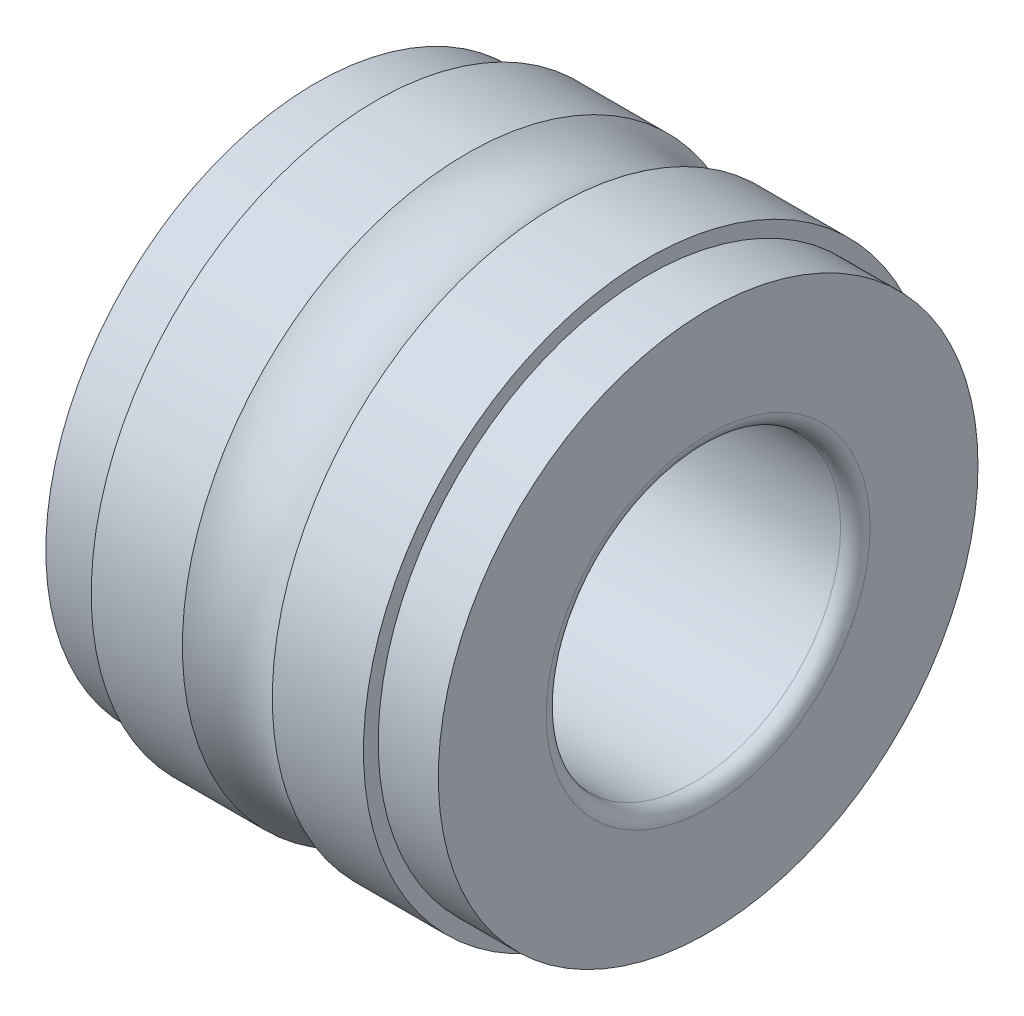
ISO-10303-21;
HEADER;
FILE_DESCRIPTION(('STEP AP214'),'2;1');
FILE_NAME('part.step','',(''),(''),'','','');
FILE_SCHEMA(('AUTOMOTIVE_DESIGN { 1 0 10303 214 1 1 1 1 }'));
ENDSEC;
DATA;
#1=APPLICATION_CONTEXT('core data for automotive mechanical design processes');
#2=APPLICATION_PROTOCOL_DEFINITION('international standard','automotive_design',2000,#1);
#3=PRODUCT_CONTEXT('',#1,'mechanical');
#4=PRODUCT('Part','Part','',(#3));
#5=PRODUCT_RELATED_PRODUCT_CATEGORY('part','',(#4));
#6=PRODUCT_DEFINITION_FORMATION('','',#4);
#7=PRODUCT_DEFINITION_CONTEXT('part definition',#1,'design');
#8=PRODUCT_DEFINITION('design','',#6,#7);
#9=PRODUCT_DEFINITION_SHAPE('','',#8);
#10=(LENGTH_UNIT() NAMED_UNIT(*) SI_UNIT(.MILLI.,.METRE.));
#11=(NAMED_UNIT(*) PLANE_ANGLE_UNIT() SI_UNIT($,.RADIAN.));
#12=(NAMED_UNIT(*) SI_UNIT($,.STERADIAN.) SOLID_ANGLE_UNIT());
#13=UNCERTAINTY_MEASURE_WITH_UNIT(LENGTH_MEASURE(1.E-05),#10,'distance_accuracy_value','');
#14=(GEOMETRIC_REPRESENTATION_CONTEXT(3) GLOBAL_UNCERTAINTY_ASSIGNED_CONTEXT((#13)) GLOBAL_UNIT_ASSIGNED_CONTEXT((#10,
#11,#12)) REPRESENTATION_CONTEXT('',''));
#15=CARTESIAN_POINT('',(0.,0.,0.));
#16=DIRECTION('',(0.,0.,1.));
#17=DIRECTION('',(1.,0.,0.));
#18=AXIS2_PLACEMENT_3D('',#15,#16,#17);
#19=CARTESIAN_POINT('',(0.899999999999999,0.,0.));
#20=DIRECTION('',(1.,0.,0.));
#21=DIRECTION('',(0.,0.,1.));
#22=AXIS2_PLACEMENT_3D('',#19,#20,#21);
#23=TOROIDAL_SURFACE('',#22,3.525,0.775000000000002);
#24=CARTESIAN_POINT('',(1.3582575695,0.,0.));
#25=DIRECTION('',(1.,0.,0.));
#26=DIRECTION('',(0.,0.,-1.));
#27=AXIS2_PLACEMENT_3D('',#24,#25,#26);
#28=CIRCLE('',#27,2.9);
#29=CARTESIAN_POINT('',(1.3582575695,0.,-2.9));
#30=VERTEX_POINT('',#29);
#31=EDGE_CURVE('E166',#30,#30,#28,.T.);
#32=ORIENTED_EDGE('',*,*,#31,.F.);
#33=EDGE_LOOP('',(#32));
#34=FACE_BOUND('',#33,.T.);
#35=CARTESIAN_POINT('',(0.441742430504409,0.,0.));
#36=DIRECTION('',(1.,0.,0.));
#37=DIRECTION('',(0.,0.,-1.));
#38=AXIS2_PLACEMENT_3D('',#35,#36,#37);
#39=CIRCLE('',#38,2.9);
#40=CARTESIAN_POINT('',(0.441742430504409,0.,-2.9));
#41=VERTEX_POINT('',#40);
#42=EDGE_CURVE('E163',#41,#41,#39,.F.);
#43=ORIENTED_EDGE('',*,*,#42,.F.);
#44=EDGE_LOOP('',(#43));
#45=FACE_BOUND('',#44,.T.);
#46=ADVANCED_FACE('F17',(#34,#45),#23,.F.);
#47=CARTESIAN_POINT('',(1.82287878475,0.,0.));
#48=DIRECTION('',(1.,0.,0.));
#49=DIRECTION('',(0.,0.,-1.));
#50=AXIS2_PLACEMENT_3D('',#47,#48,#49);
#51=CYLINDRICAL_SURFACE('',#50,2.9);
#52=CARTESIAN_POINT('',(2.2875,0.,0.));
#53=DIRECTION('',(1.,0.,0.));
#54=DIRECTION('',(0.,0.,-1.));
#55=AXIS2_PLACEMENT_3D('',#52,#53,#54);
#56=CIRCLE('',#55,2.9);
#57=CARTESIAN_POINT('',(2.2875,0.,-2.9));
#58=VERTEX_POINT('',#57);
#59=EDGE_CURVE('E165',#58,#58,#56,.T.);
#60=ORIENTED_EDGE('',*,*,#59,.F.);
#61=EDGE_LOOP('',(#60));
#62=FACE_BOUND('',#61,.T.);
#63=ORIENTED_EDGE('',*,*,#31,.T.);
#64=EDGE_LOOP('',(#63));
#65=FACE_BOUND('',#64,.T.);
#66=ADVANCED_FACE('F97',(#62,#65),#51,.T.);
#67=CARTESIAN_POINT('',(-0.0228787847477956,0.,0.));
#68=DIRECTION('',(1.,0.,0.));
#69=DIRECTION('',(0.,0.,-1.));
#70=AXIS2_PLACEMENT_3D('',#67,#68,#69);
#71=CYLINDRICAL_SURFACE('',#70,2.9);
#72=ORIENTED_EDGE('',*,*,#42,.T.);
#73=EDGE_LOOP('',(#72));
#74=FACE_BOUND('',#73,.T.);
#75=CARTESIAN_POINT('',(-0.4875,0.,0.));
#76=DIRECTION('',(1.,0.,0.));
#77=DIRECTION('',(0.,0.,-1.));
#78=AXIS2_PLACEMENT_3D('',#75,#76,#77);
#79=CIRCLE('',#78,2.9);
#80=CARTESIAN_POINT('',(-0.4875,0.,-2.9));
#81=VERTEX_POINT('',#80);
#82=EDGE_CURVE('E183',#81,#81,#79,.F.);
#83=ORIENTED_EDGE('',*,*,#82,.F.);
#84=EDGE_LOOP('',(#83));
#85=FACE_BOUND('',#84,.T.);
#86=ADVANCED_FACE('F94',(#74,#85),#71,.T.);
#87=CARTESIAN_POINT('',(2.2875,0.,-2.825));
#88=DIRECTION('',(1.,0.,0.));
#89=DIRECTION('',(0.,0.,-1.));
#90=AXIS2_PLACEMENT_3D('',#87,#88,#89);
#91=PLANE('',#90);
#92=ORIENTED_EDGE('',*,*,#59,.T.);
#93=EDGE_LOOP('',(#92));
#94=FACE_BOUND('',#93,.T.);
#95=CARTESIAN_POINT('',(2.2875,0.,0.));
#96=DIRECTION('',(1.,0.,0.));
#97=DIRECTION('',(0.,0.,-1.));
#98=AXIS2_PLACEMENT_3D('',#95,#96,#97);
#99=CIRCLE('',#98,2.75);
#100=CARTESIAN_POINT('',(2.2875,0.,-2.75));
#101=VERTEX_POINT('',#100);
#102=EDGE_CURVE('E180',#101,#101,#99,.T.);
#103=ORIENTED_EDGE('',*,*,#102,.F.);
#104=EDGE_LOOP('',(#103));
#105=FACE_BOUND('',#104,.T.);
#106=ADVANCED_FACE('F90',(#94,#105),#91,.T.);
#107=CARTESIAN_POINT('',(-0.4875,0.,-2.825));
#108=DIRECTION('',(-1.,0.,0.));
#109=DIRECTION('',(0.,0.,1.));
#110=AXIS2_PLACEMENT_3D('',#107,#108,#109);
#111=PLANE('',#110);
#112=CARTESIAN_POINT('',(-0.4875,0.,0.));
#113=DIRECTION('',(1.,0.,0.));
#114=DIRECTION('',(0.,0.,-1.));
#115=AXIS2_PLACEMENT_3D('',#112,#113,#114);
#116=CIRCLE('',#115,2.75);
#117=CARTESIAN_POINT('',(-0.4875,0.,-2.75));
#118=VERTEX_POINT('',#117);
#119=EDGE_CURVE('E177',#118,#118,#116,.F.);
#120=ORIENTED_EDGE('',*,*,#119,.F.);
#121=EDGE_LOOP('',(#120));
#122=FACE_BOUND('',#121,.T.);
#123=ORIENTED_EDGE('',*,*,#82,.T.);
#124=EDGE_LOOP('',(#123));
#125=FACE_BOUND('',#124,.T.);
#126=ADVANCED_FACE('F86',(#122,#125),#111,.T.);
#127=CARTESIAN_POINT('',(2.59375,0.,0.));
#128=DIRECTION('',(1.,0.,0.));
#129=DIRECTION('',(0.,0.,-1.));
#130=AXIS2_PLACEMENT_3D('',#127,#128,#129);
#131=CYLINDRICAL_SURFACE('',#130,2.75);
#132=CARTESIAN_POINT('',(2.9,0.,0.));
#133=DIRECTION('',(1.,0.,0.));
#134=DIRECTION('',(0.,0.,-1.));
#135=AXIS2_PLACEMENT_3D('',#132,#133,#134);
#136=CIRCLE('',#135,2.75);
#137=CARTESIAN_POINT('',(2.9,0.,-2.75));
#138=VERTEX_POINT('',#137);
#139=EDGE_CURVE('E174',#138,#138,#136,.T.);
#140=ORIENTED_EDGE('',*,*,#139,.F.);
#141=EDGE_LOOP('',(#140));
#142=FACE_BOUND('',#141,.T.);
#143=ORIENTED_EDGE('',*,*,#102,.T.);
#144=EDGE_LOOP('',(#143));
#145=FACE_BOUND('',#144,.T.);
#146=ADVANCED_FACE('F82',(#142,#145),#131,.T.);
#147=CARTESIAN_POINT('',(-0.79375,0.,0.));
#148=DIRECTION('',(1.,0.,0.));
#149=DIRECTION('',(0.,0.,-1.));
#150=AXIS2_PLACEMENT_3D('',#147,#148,#149);
#151=CYLINDRICAL_SURFACE('',#150,2.75);
#152=ORIENTED_EDGE('',*,*,#119,.T.);
#153=EDGE_LOOP('',(#152));
#154=FACE_BOUND('',#153,.T.);
#155=CARTESIAN_POINT('',(-1.1,0.,0.));
#156=DIRECTION('',(1.,0.,0.));
#157=DIRECTION('',(0.,0.,-1.));
#158=AXIS2_PLACEMENT_3D('',#155,#156,#157);
#159=CIRCLE('',#158,2.75);
#160=CARTESIAN_POINT('',(-1.1,0.,-2.75));
#161=VERTEX_POINT('',#160);
#162=EDGE_CURVE('E171',#161,#161,#159,.F.);
#163=ORIENTED_EDGE('',*,*,#162,.F.);
#164=EDGE_LOOP('',(#163));
#165=FACE_BOUND('',#164,.T.);
#166=ADVANCED_FACE('F76',(#154,#165),#151,.T.);
#167=CARTESIAN_POINT('',(2.9,0.,-2.2));
#168=DIRECTION('',(1.,0.,0.));
#169=DIRECTION('',(0.,0.,-1.));
#170=AXIS2_PLACEMENT_3D('',#167,#168,#169);
#171=PLANE('',#170);
#172=ORIENTED_EDGE('',*,*,#139,.T.);
#173=EDGE_LOOP('',(#172));
#174=FACE_BOUND('',#173,.T.);
#175=CARTESIAN_POINT('',(2.9,0.,0.));
#176=DIRECTION('',(1.,0.,0.));
#177=DIRECTION('',(0.,0.,-1.));
#178=AXIS2_PLACEMENT_3D('',#175,#176,#177);
#179=CIRCLE('',#178,1.65);
#180=CARTESIAN_POINT('',(2.9,0.,-1.65));
#181=VERTEX_POINT('',#180);
#182=CARTESIAN_POINT('',(2.9,0.,1.65));
#183=VERTEX_POINT('',#182);
#184=EDGE_CURVE('E46',#181,#183,#179,.T.);
#185=ORIENTED_EDGE('',*,*,#184,.F.);
#186=CARTESIAN_POINT('',(2.9,0.,0.));
#187=DIRECTION('',(1.,0.,0.));
#188=DIRECTION('',(0.,0.,1.));
#189=AXIS2_PLACEMENT_3D('',#186,#187,#188);
#190=CIRCLE('',#189,1.65);
#191=EDGE_CURVE('E50',#183,#181,#190,.T.);
#192=ORIENTED_EDGE('',*,*,#191,.F.);
#193=EDGE_LOOP('',(#185,#192));
#194=FACE_BOUND('',#193,.T.);
#195=ADVANCED_FACE('F56',(#174,#194),#171,.T.);
#196=CARTESIAN_POINT('',(-1.1,0.,-2.2));
#197=DIRECTION('',(-1.,0.,0.));
#198=DIRECTION('',(0.,0.,1.));
#199=AXIS2_PLACEMENT_3D('',#196,#197,#198);
#200=PLANE('',#199);
#201=CARTESIAN_POINT('',(-1.1,0.,0.));
#202=DIRECTION('',(-1.,0.,0.));
#203=DIRECTION('',(0.,0.,1.));
#204=AXIS2_PLACEMENT_3D('',#201,#202,#203);
#205=CIRCLE('',#204,1.65);
#206=CARTESIAN_POINT('',(-1.1,0.,1.65));
#207=VERTEX_POINT('',#206);
#208=CARTESIAN_POINT('',(-1.1,0.,-1.65));
#209=VERTEX_POINT('',#208);
#210=EDGE_CURVE('E35',#207,#209,#205,.T.);
#211=ORIENTED_EDGE('',*,*,#210,.F.);
#212=CARTESIAN_POINT('',(-1.1,0.,0.));
#213=DIRECTION('',(-1.,0.,0.));
#214=DIRECTION('',(0.,0.,-1.));
#215=AXIS2_PLACEMENT_3D('',#212,#213,#214);
#216=CIRCLE('',#215,1.65);
#217=EDGE_CURVE('E57',#209,#207,#216,.T.);
#218=ORIENTED_EDGE('',*,*,#217,.F.);
#219=EDGE_LOOP('',(#211,#218));
#220=FACE_BOUND('',#219,.T.);
#221=ORIENTED_EDGE('',*,*,#162,.T.);
#222=EDGE_LOOP('',(#221));
#223=FACE_BOUND('',#222,.T.);
#224=ADVANCED_FACE('F75',(#220,#223),#200,.T.);
#225=CARTESIAN_POINT('',(2.75,0.,0.));
#226=DIRECTION('',(1.,0.,0.));
#227=DIRECTION('',(0.,0.,1.));
#228=AXIS2_PLACEMENT_3D('',#225,#226,#227);
#229=TOROIDAL_SURFACE('',#228,1.65,0.149999999999999);
#230=ORIENTED_EDGE('',*,*,#184,.T.);
#231=ORIENTED_EDGE('',*,*,#191,.T.);
#232=EDGE_LOOP('',(#230,#231));
#233=FACE_BOUND('',#232,.T.);
#234=CARTESIAN_POINT('',(2.75,0.,0.));
#235=DIRECTION('',(1.,0.,0.));
#236=DIRECTION('',(0.,0.,-1.));
#237=AXIS2_PLACEMENT_3D('',#234,#235,#236);
#238=CIRCLE('',#237,1.5);
#239=CARTESIAN_POINT('',(2.75,0.,-1.5));
#240=VERTEX_POINT('',#239);
#241=EDGE_CURVE('E29',#240,#240,#238,.F.);
#242=ORIENTED_EDGE('',*,*,#241,.T.);
#243=EDGE_LOOP('',(#242));
#244=FACE_BOUND('',#243,.T.);
#245=ADVANCED_FACE('F48',(#233,#244),#229,.T.);
#246=CARTESIAN_POINT('',(-0.95,0.,0.));
#247=DIRECTION('',(1.,0.,0.));
#248=DIRECTION('',(0.,0.,1.));
#249=AXIS2_PLACEMENT_3D('',#246,#247,#248);
#250=TOROIDAL_SURFACE('',#249,1.65,0.15);
#251=CARTESIAN_POINT('',(-0.95,0.,0.));
#252=DIRECTION('',(1.,0.,0.));
#253=DIRECTION('',(0.,0.,-1.));
#254=AXIS2_PLACEMENT_3D('',#251,#252,#253);
#255=CIRCLE('',#254,1.5);
#256=CARTESIAN_POINT('',(-0.95,0.,-1.5));
#257=VERTEX_POINT('',#256);
#258=EDGE_CURVE('E11',#257,#257,#255,.T.);
#259=ORIENTED_EDGE('',*,*,#258,.T.);
#260=EDGE_LOOP('',(#259));
#261=FACE_BOUND('',#260,.T.);
#262=ORIENTED_EDGE('',*,*,#217,.T.);
#263=ORIENTED_EDGE('',*,*,#210,.T.);
#264=EDGE_LOOP('',(#262,#263));
#265=FACE_BOUND('',#264,.T.);
#266=ADVANCED_FACE('F110',(#261,#265),#250,.T.);
#267=CARTESIAN_POINT('',(0.9,0.,0.));
#268=DIRECTION('',(1.,0.,0.));
#269=DIRECTION('',(0.,0.,-1.));
#270=AXIS2_PLACEMENT_3D('',#267,#268,#269);
#271=CYLINDRICAL_SURFACE('',#270,1.5);
#272=ORIENTED_EDGE('',*,*,#258,.F.);
#273=EDGE_LOOP('',(#272));
#274=FACE_BOUND('',#273,.T.);
#275=ORIENTED_EDGE('',*,*,#241,.F.);
#276=EDGE_LOOP('',(#275));
#277=FACE_BOUND('',#276,.T.);
#278=ADVANCED_FACE('F108',(#274,#277),#271,.F.);
#279=CLOSED_SHELL('',(#46,#66,#86,#106,#126,#146,#166,#195,#224,#245,#266,#278));
#280=MANIFOLD_SOLID_BREP('B1',#279);
#281=ADVANCED_BREP_SHAPE_REPRESENTATION('',(#18,#280),#14);
#282=SHAPE_DEFINITION_REPRESENTATION(#9,#281);
ENDSEC;
END-ISO-10303-21;
